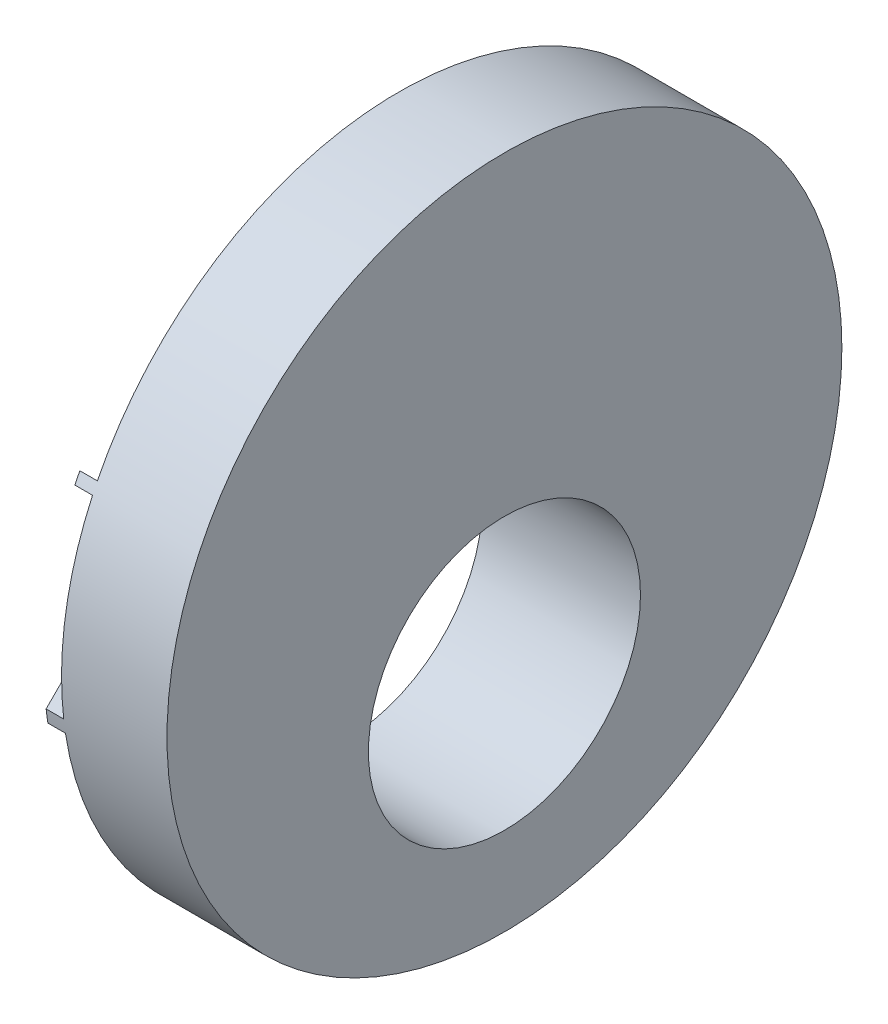
ISO-10303-21;
HEADER;
FILE_DESCRIPTION(('STEP AP214'),'2;1');
FILE_NAME('part.step','',(''),(''),'','','');
FILE_SCHEMA(('AUTOMOTIVE_DESIGN { 1 0 10303 214 1 1 1 1 }'));
ENDSEC;
DATA;
#1=APPLICATION_CONTEXT('core data for automotive mechanical design processes');
#2=APPLICATION_PROTOCOL_DEFINITION('international standard','automotive_design',2000,#1);
#3=PRODUCT_CONTEXT('',#1,'mechanical');
#4=PRODUCT('Part','Part','',(#3));
#5=PRODUCT_RELATED_PRODUCT_CATEGORY('part','',(#4));
#6=PRODUCT_DEFINITION_FORMATION('','',#4);
#7=PRODUCT_DEFINITION_CONTEXT('part definition',#1,'design');
#8=PRODUCT_DEFINITION('design','',#6,#7);
#9=PRODUCT_DEFINITION_SHAPE('','',#8);
#10=(LENGTH_UNIT() NAMED_UNIT(*) SI_UNIT(.MILLI.,.METRE.));
#11=(NAMED_UNIT(*) PLANE_ANGLE_UNIT() SI_UNIT($,.RADIAN.));
#12=(NAMED_UNIT(*) SI_UNIT($,.STERADIAN.) SOLID_ANGLE_UNIT());
#13=UNCERTAINTY_MEASURE_WITH_UNIT(LENGTH_MEASURE(1.E-05),#10,'distance_accuracy_value','');
#14=(GEOMETRIC_REPRESENTATION_CONTEXT(3) GLOBAL_UNCERTAINTY_ASSIGNED_CONTEXT((#13)) GLOBAL_UNIT_ASSIGNED_CONTEXT((#10,
#11,#12)) REPRESENTATION_CONTEXT('',''));
#15=CARTESIAN_POINT('',(0.,0.,0.));
#16=DIRECTION('',(0.,0.,1.));
#17=DIRECTION('',(1.,0.,0.));
#18=AXIS2_PLACEMENT_3D('',#15,#16,#17);
#19=CARTESIAN_POINT('',(-7.5,0.,0.));
#20=DIRECTION('',(1.,0.,0.));
#21=DIRECTION('',(0.,0.,-1.));
#22=AXIS2_PLACEMENT_3D('',#19,#20,#21);
#23=PLANE('',#22);
#24=DIRECTION('',(0.,-0.707106781186547,-0.707106781186548));
#25=VECTOR('',#24,1.);
#26=CARTESIAN_POINT('',(-7.5,20.0772731857966,-20.0772731857966));
#27=LINE('',#26,#25);
#28=CARTESIAN_POINT('',(-7.5,3.21520654337298,-36.9393398282202));
#29=VERTEX_POINT('',#28);
#30=CARTESIAN_POINT('',(-7.5,-0.343943144876353,-40.4984895164695));
#31=VERTEX_POINT('',#30);
#32=EDGE_CURVE('E338',#29,#31,#27,.T.);
#33=ORIENTED_EDGE('',*,*,#32,.T.);
#34=CARTESIAN_POINT('',(-7.5,0.,0.));
#35=DIRECTION('',(-1.,0.,0.));
#36=DIRECTION('',(0.,0.,1.));
#37=AXIS2_PLACEMENT_3D('',#34,#35,#36);
#38=CIRCLE('',#37,40.49995);
#39=CARTESIAN_POINT('',(-7.5,-36.5562476229281,-17.4323466502265));
#40=VERTEX_POINT('',#39);
#41=EDGE_CURVE('E656',#31,#40,#38,.T.);
#42=ORIENTED_EDGE('',*,*,#41,.T.);
#43=CARTESIAN_POINT('',(-7.5,-16.134793456627,0.));
#44=DIRECTION('',(1.,0.,0.));
#45=DIRECTION('',(0.,0.,-1.));
#46=AXIS2_PLACEMENT_3D('',#43,#44,#45);
#47=CIRCLE('',#46,26.85);
#48=CARTESIAN_POINT('',(-7.5,3.21520654337299,-18.6145104689863));
#49=VERTEX_POINT('',#48);
#50=EDGE_CURVE('E545',#49,#40,#47,.F.);
#51=ORIENTED_EDGE('',*,*,#50,.F.);
#52=DIRECTION('',(0.,0.,1.));
#53=VECTOR('',#52,1.);
#54=CARTESIAN_POINT('',(-7.5,3.21520654337299,0.));
#55=LINE('',#54,#53);
#56=EDGE_CURVE('E413',#29,#49,#55,.T.);
#57=ORIENTED_EDGE('',*,*,#56,.F.);
#58=EDGE_LOOP('',(#33,#42,#51,#57));
#59=FACE_BOUND('',#58,.T.);
#60=ADVANCED_FACE('F41',(#59),#23,.F.);
#61=CARTESIAN_POINT('',(-7.5,-36.5562476229281,17.4323466502265));
#62=VERTEX_POINT('',#61);
#63=CARTESIAN_POINT('',(-7.5,3.21520654337299,18.6145104689863));
#64=VERTEX_POINT('',#63);
#65=EDGE_CURVE('E550',#62,#64,#47,.F.);
#66=ORIENTED_EDGE('',*,*,#65,.F.);
#67=CARTESIAN_POINT('',(-7.5,-0.343943144876385,40.4984895164695));
#68=VERTEX_POINT('',#67);
#69=EDGE_CURVE('E571',#62,#68,#38,.T.);
#70=ORIENTED_EDGE('',*,*,#69,.T.);
#71=DIRECTION('',(0.,-0.707106781186552,0.707106781186543));
#72=VECTOR('',#71,1.);
#73=CARTESIAN_POINT('',(-7.5,20.0772731857966,20.0772731857968));
#74=LINE('',#73,#72);
#75=CARTESIAN_POINT('',(-7.5,3.21520654337299,36.9393398282202));
#76=VERTEX_POINT('',#75);
#77=EDGE_CURVE('E417',#76,#68,#74,.T.);
#78=ORIENTED_EDGE('',*,*,#77,.F.);
#79=EDGE_CURVE('E418',#64,#76,#55,.T.);
#80=ORIENTED_EDGE('',*,*,#79,.F.);
#81=EDGE_LOOP('',(#66,#70,#78,#80));
#82=FACE_BOUND('',#81,.T.);
#83=ADVANCED_FACE('F645',(#82),#23,.F.);
#84=DIRECTION('',(0.,-1.,0.));
#85=VECTOR('',#84,1.);
#86=CARTESIAN_POINT('',(-7.5,0.,-38.));
#87=LINE('',#86,#85);
#88=CARTESIAN_POINT('',(-7.5,14.0087811747668,-38.));
#89=VERTEX_POINT('',#88);
#90=CARTESIAN_POINT('',(-7.5,4.27586671515281,-38.));
#91=VERTEX_POINT('',#90);
#92=EDGE_CURVE('E441',#89,#91,#87,.T.);
#93=ORIENTED_EDGE('',*,*,#92,.F.);
#94=CARTESIAN_POINT('',(-7.5,1.8166821462312,-40.4591845689216));
#95=VERTEX_POINT('',#94);
#96=EDGE_CURVE('E663',#89,#95,#38,.T.);
#97=ORIENTED_EDGE('',*,*,#96,.T.);
#98=DIRECTION('',(0.,-0.707106781186546,-0.707106781186549));
#99=VECTOR('',#98,1.);
#100=CARTESIAN_POINT('',(-7.5,21.1379333575764,-21.1379333575764));
#101=LINE('',#100,#99);
#102=EDGE_CURVE('E344',#91,#95,#101,.T.);
#103=ORIENTED_EDGE('',*,*,#102,.F.);
#104=EDGE_LOOP('',(#93,#97,#103));
#105=FACE_BOUND('',#104,.T.);
#106=ADVANCED_FACE('F637',(#105),#23,.F.);
#107=DIRECTION('',(0.,-0.707106781186552,0.707106781186543));
#108=VECTOR('',#107,1.);
#109=CARTESIAN_POINT('',(-7.5,21.1379333575764,21.1379333575766));
#110=LINE('',#109,#108);
#111=CARTESIAN_POINT('',(-7.5,4.27586671515281,38.));
#112=VERTEX_POINT('',#111);
#113=CARTESIAN_POINT('',(-7.5,1.81668214623118,40.4591845689216));
#114=VERTEX_POINT('',#113);
#115=EDGE_CURVE('E422',#112,#114,#110,.T.);
#116=ORIENTED_EDGE('',*,*,#115,.T.);
#117=CARTESIAN_POINT('',(-7.5,14.0087811747668,38.));
#118=VERTEX_POINT('',#117);
#119=EDGE_CURVE('E269',#114,#118,#38,.T.);
#120=ORIENTED_EDGE('',*,*,#119,.T.);
#121=DIRECTION('',(0.,1.,0.));
#122=VECTOR('',#121,1.);
#123=CARTESIAN_POINT('',(-7.5,0.,38.));
#124=LINE('',#123,#122);
#125=EDGE_CURVE('E425',#112,#118,#124,.T.);
#126=ORIENTED_EDGE('',*,*,#125,.F.);
#127=EDGE_LOOP('',(#116,#120,#126));
#128=FACE_BOUND('',#127,.T.);
#129=ADVANCED_FACE('F634',(#128),#23,.F.);
#130=DIRECTION('',(0.,0.70710678118655,0.707106781186545));
#131=VECTOR('',#130,1.);
#132=CARTESIAN_POINT('',(-7.5,-10.6870666424237,10.6870666424237));
#133=LINE('',#132,#131);
#134=CARTESIAN_POINT('',(-7.5,15.565206543373,36.9393398282202));
#135=VERTEX_POINT('',#134);
#136=CARTESIAN_POINT('',(-7.5,15.8818923432357,37.2560256280829));
#137=VERTEX_POINT('',#136);
#138=EDGE_CURVE('E429',#135,#137,#133,.T.);
#139=ORIENTED_EDGE('',*,*,#138,.T.);
#140=CARTESIAN_POINT('',(-7.5,15.8818923432357,-37.2560256280829));
#141=VERTEX_POINT('',#140);
#142=EDGE_CURVE('E569',#137,#141,#38,.T.);
#143=ORIENTED_EDGE('',*,*,#142,.T.);
#144=DIRECTION('',(0.,0.707106781186552,-0.707106781186543));
#145=VECTOR('',#144,1.);
#146=CARTESIAN_POINT('',(-7.5,-10.6870666424237,-10.6870666424238));
#147=LINE('',#146,#145);
#148=CARTESIAN_POINT('',(-7.5,15.565206543373,-36.9393398282202));
#149=VERTEX_POINT('',#148);
#150=EDGE_CURVE('E437',#149,#141,#147,.T.);
#151=ORIENTED_EDGE('',*,*,#150,.F.);
#152=DIRECTION('',(0.,0.,-1.));
#153=VECTOR('',#152,1.);
#154=CARTESIAN_POINT('',(-7.5,15.565206543373,0.));
#155=LINE('',#154,#153);
#156=EDGE_CURVE('E433',#135,#149,#155,.T.);
#157=ORIENTED_EDGE('',*,*,#156,.F.);
#158=EDGE_LOOP('',(#139,#143,#151,#157));
#159=FACE_BOUND('',#158,.T.);
#160=ADVANCED_FACE('F636',(#159),#23,.F.);
#161=CARTESIAN_POINT('',(-17.5,3.21520654337299,0.));
#162=DIRECTION('',(0.,1.,0.));
#163=DIRECTION('',(0.,0.,1.));
#164=AXIS2_PLACEMENT_3D('',#161,#162,#163);
#165=PLANE('',#164);
#166=DIRECTION('',(1.,0.,0.));
#167=VECTOR('',#166,1.);
#168=CARTESIAN_POINT('',(-22.5,3.21520654337299,18.6145104689863));
#169=LINE('',#168,#167);
#170=CARTESIAN_POINT('',(-17.5,3.21520654337299,18.6145104689863));
#171=VERTEX_POINT('',#170);
#172=EDGE_CURVE('E329',#64,#171,#169,.F.);
#173=ORIENTED_EDGE('',*,*,#172,.F.);
#174=ORIENTED_EDGE('',*,*,#79,.T.);
#175=DIRECTION('',(1.,0.,0.));
#176=VECTOR('',#175,1.);
#177=CARTESIAN_POINT('',(-17.5,3.21520654337299,36.9393398282202));
#178=LINE('',#177,#176);
#179=CARTESIAN_POINT('',(-17.5,3.21520654337299,36.9393398282202));
#180=VERTEX_POINT('',#179);
#181=EDGE_CURVE('E501',#180,#76,#178,.T.);
#182=ORIENTED_EDGE('',*,*,#181,.F.);
#183=DIRECTION('',(0.,0.,1.));
#184=VECTOR('',#183,1.);
#185=CARTESIAN_POINT('',(-17.5,3.21520654337299,0.));
#186=LINE('',#185,#184);
#187=EDGE_CURVE('E360',#171,#180,#186,.T.);
#188=ORIENTED_EDGE('',*,*,#187,.F.);
#189=EDGE_LOOP('',(#173,#174,#182,#188));
#190=FACE_BOUND('',#189,.T.);
#191=ADVANCED_FACE('F643',(#190),#165,.F.);
#192=DIRECTION('',(1.,0.,0.));
#193=VECTOR('',#192,1.);
#194=CARTESIAN_POINT('',(-22.5,3.21520654337299,-18.6145104689863));
#195=LINE('',#194,#193);
#196=CARTESIAN_POINT('',(-17.5,3.21520654337299,-18.6145104689863));
#197=VERTEX_POINT('',#196);
#198=EDGE_CURVE('E334',#197,#49,#195,.T.);
#199=ORIENTED_EDGE('',*,*,#198,.F.);
#200=CARTESIAN_POINT('',(-17.5,3.21520654337298,-36.9393398282202));
#201=VERTEX_POINT('',#200);
#202=EDGE_CURVE('E361',#201,#197,#186,.T.);
#203=ORIENTED_EDGE('',*,*,#202,.F.);
#204=DIRECTION('',(1.,0.,0.));
#205=VECTOR('',#204,1.);
#206=CARTESIAN_POINT('',(-17.5,3.21520654337298,-36.9393398282202));
#207=LINE('',#206,#205);
#208=EDGE_CURVE('E505',#201,#29,#207,.T.);
#209=ORIENTED_EDGE('',*,*,#208,.T.);
#210=ORIENTED_EDGE('',*,*,#56,.T.);
#211=EDGE_LOOP('',(#199,#203,#209,#210));
#212=FACE_BOUND('',#211,.T.);
#213=ADVANCED_FACE('F745',(#212),#165,.F.);
#214=CARTESIAN_POINT('',(-7.5,12.565206543373,35.));
#215=DIRECTION('',(0.,0.,1.));
#216=DIRECTION('',(1.,0.,0.));
#217=AXIS2_PLACEMENT_3D('',#214,#215,#216);
#218=PLANE('',#217);
#219=DIRECTION('',(0.,-1.,0.));
#220=VECTOR('',#219,1.);
#221=CARTESIAN_POINT('',(-5.,12.565206543373,35.));
#222=LINE('',#221,#220);
#223=CARTESIAN_POINT('',(-5.,12.565206543373,35.));
#224=VERTEX_POINT('',#223);
#225=CARTESIAN_POINT('',(-5.,6.21520654337299,35.));
#226=VERTEX_POINT('',#225);
#227=EDGE_CURVE('E512',#224,#226,#222,.T.);
#228=ORIENTED_EDGE('',*,*,#227,.T.);
#229=DIRECTION('',(1.,0.,0.));
#230=VECTOR('',#229,1.);
#231=CARTESIAN_POINT('',(-7.5,6.21520654337299,35.));
#232=LINE('',#231,#230);
#233=CARTESIAN_POINT('',(-17.5,6.21520654337299,35.));
#234=VERTEX_POINT('',#233);
#235=EDGE_CURVE('E522',#234,#226,#232,.T.);
#236=ORIENTED_EDGE('',*,*,#235,.F.);
#237=DIRECTION('',(0.,-1.,0.));
#238=VECTOR('',#237,1.);
#239=CARTESIAN_POINT('',(-17.5,0.,35.));
#240=LINE('',#239,#238);
#241=CARTESIAN_POINT('',(-17.5,12.565206543373,35.));
#242=VERTEX_POINT('',#241);
#243=EDGE_CURVE('E348',#242,#234,#240,.T.);
#244=ORIENTED_EDGE('',*,*,#243,.F.);
#245=DIRECTION('',(1.,0.,0.));
#246=VECTOR('',#245,1.);
#247=CARTESIAN_POINT('',(-7.5,12.565206543373,35.));
#248=LINE('',#247,#246);
#249=EDGE_CURVE('E523',#242,#224,#248,.T.);
#250=ORIENTED_EDGE('',*,*,#249,.T.);
#251=EDGE_LOOP('',(#228,#236,#244,#250));
#252=FACE_BOUND('',#251,.T.);
#253=ADVANCED_FACE('F756',(#252),#218,.F.);
#254=CARTESIAN_POINT('',(-7.5,12.565206543373,-35.));
#255=DIRECTION('',(0.,1.,0.));
#256=DIRECTION('',(0.,0.,1.));
#257=AXIS2_PLACEMENT_3D('',#254,#255,#256);
#258=PLANE('',#257);
#259=DIRECTION('',(0.,0.,1.));
#260=VECTOR('',#259,1.);
#261=CARTESIAN_POINT('',(-5.,12.565206543373,-35.));
#262=LINE('',#261,#260);
#263=CARTESIAN_POINT('',(-5.,12.565206543373,-35.));
#264=VERTEX_POINT('',#263);
#265=EDGE_CURVE('E509',#264,#224,#262,.T.);
#266=ORIENTED_EDGE('',*,*,#265,.T.);
#267=ORIENTED_EDGE('',*,*,#249,.F.);
#268=DIRECTION('',(0.,0.,1.));
#269=VECTOR('',#268,1.);
#270=CARTESIAN_POINT('',(-17.5,12.565206543373,0.));
#271=LINE('',#270,#269);
#272=CARTESIAN_POINT('',(-17.5,12.565206543373,-35.));
#273=VERTEX_POINT('',#272);
#274=EDGE_CURVE('E343',#273,#242,#271,.T.);
#275=ORIENTED_EDGE('',*,*,#274,.F.);
#276=DIRECTION('',(1.,0.,0.));
#277=VECTOR('',#276,1.);
#278=CARTESIAN_POINT('',(-7.5,12.565206543373,-35.));
#279=LINE('',#278,#277);
#280=EDGE_CURVE('E528',#273,#264,#279,.T.);
#281=ORIENTED_EDGE('',*,*,#280,.T.);
#282=EDGE_LOOP('',(#266,#267,#275,#281));
#283=FACE_BOUND('',#282,.T.);
#284=ADVANCED_FACE('F752',(#283),#258,.F.);
#285=CARTESIAN_POINT('',(-7.5,6.21520654337299,-35.));
#286=DIRECTION('',(0.,0.,-1.));
#287=DIRECTION('',(-1.,0.,0.));
#288=AXIS2_PLACEMENT_3D('',#285,#286,#287);
#289=PLANE('',#288);
#290=DIRECTION('',(0.,1.,0.));
#291=VECTOR('',#290,1.);
#292=CARTESIAN_POINT('',(-5.,6.21520654337299,-35.));
#293=LINE('',#292,#291);
#294=CARTESIAN_POINT('',(-5.,6.21520654337299,-35.));
#295=VERTEX_POINT('',#294);
#296=EDGE_CURVE('E519',#295,#264,#293,.T.);
#297=ORIENTED_EDGE('',*,*,#296,.T.);
#298=ORIENTED_EDGE('',*,*,#280,.F.);
#299=DIRECTION('',(0.,1.,0.));
#300=VECTOR('',#299,1.);
#301=CARTESIAN_POINT('',(-17.5,0.,-35.));
#302=LINE('',#301,#300);
#303=CARTESIAN_POINT('',(-17.5,6.21520654337299,-35.));
#304=VERTEX_POINT('',#303);
#305=EDGE_CURVE('E339',#304,#273,#302,.T.);
#306=ORIENTED_EDGE('',*,*,#305,.F.);
#307=DIRECTION('',(1.,0.,0.));
#308=VECTOR('',#307,1.);
#309=CARTESIAN_POINT('',(-7.5,6.21520654337299,-35.));
#310=LINE('',#309,#308);
#311=EDGE_CURVE('E532',#304,#295,#310,.T.);
#312=ORIENTED_EDGE('',*,*,#311,.T.);
#313=EDGE_LOOP('',(#297,#298,#306,#312));
#314=FACE_BOUND('',#313,.T.);
#315=ADVANCED_FACE('F755',(#314),#289,.F.);
#316=CARTESIAN_POINT('',(-7.5,6.21520654337299,35.));
#317=DIRECTION('',(0.,-1.,0.));
#318=DIRECTION('',(0.,0.,-1.));
#319=AXIS2_PLACEMENT_3D('',#316,#317,#318);
#320=PLANE('',#319);
#321=DIRECTION('',(0.,0.,-1.));
#322=VECTOR('',#321,1.);
#323=CARTESIAN_POINT('',(-17.5,6.21520654337299,0.));
#324=LINE('',#323,#322);
#325=CARTESIAN_POINT('',(-17.5,6.21520654337299,-14.8795161211647));
#326=VERTEX_POINT('',#325);
#327=EDGE_CURVE('E352',#326,#304,#324,.T.);
#328=ORIENTED_EDGE('',*,*,#327,.F.);
#329=DIRECTION('',(1.,0.,0.));
#330=VECTOR('',#329,1.);
#331=CARTESIAN_POINT('',(-22.5,6.21520654337298,-14.8795161211647));
#332=LINE('',#331,#330);
#333=CARTESIAN_POINT('',(-22.5,6.21520654337298,-14.8795161211647));
#334=VERTEX_POINT('',#333);
#335=EDGE_CURVE('E319',#334,#326,#332,.T.);
#336=ORIENTED_EDGE('',*,*,#335,.F.);
#337=DIRECTION('',(0.,0.,-1.));
#338=VECTOR('',#337,1.);
#339=CARTESIAN_POINT('',(-22.5,6.21520654337298,14.8795161211647));
#340=LINE('',#339,#338);
#341=CARTESIAN_POINT('',(-22.5,6.21520654337298,14.8795161211647));
#342=VERTEX_POINT('',#341);
#343=EDGE_CURVE('E316',#342,#334,#340,.T.);
#344=ORIENTED_EDGE('',*,*,#343,.F.);
#345=DIRECTION('',(1.,0.,0.));
#346=VECTOR('',#345,1.);
#347=CARTESIAN_POINT('',(-22.5,6.21520654337298,14.8795161211647));
#348=LINE('',#347,#346);
#349=CARTESIAN_POINT('',(-17.5,6.21520654337299,14.8795161211647));
#350=VERTEX_POINT('',#349);
#351=EDGE_CURVE('E323',#342,#350,#348,.T.);
#352=ORIENTED_EDGE('',*,*,#351,.T.);
#353=EDGE_CURVE('E353',#234,#350,#324,.T.);
#354=ORIENTED_EDGE('',*,*,#353,.F.);
#355=ORIENTED_EDGE('',*,*,#235,.T.);
#356=DIRECTION('',(0.,0.,-1.));
#357=VECTOR('',#356,1.);
#358=CARTESIAN_POINT('',(-5.,6.21520654337299,35.));
#359=LINE('',#358,#357);
#360=EDGE_CURVE('E516',#226,#295,#359,.T.);
#361=ORIENTED_EDGE('',*,*,#360,.T.);
#362=ORIENTED_EDGE('',*,*,#311,.F.);
#363=EDGE_LOOP('',(#328,#336,#344,#352,#354,#355,#361,#362));
#364=FACE_BOUND('',#363,.T.);
#365=ADVANCED_FACE('F684',(#364),#320,.F.);
#366=CARTESIAN_POINT('',(-5.,0.,0.));
#367=DIRECTION('',(1.,0.,0.));
#368=DIRECTION('',(0.,0.,-1.));
#369=AXIS2_PLACEMENT_3D('',#366,#367,#368);
#370=PLANE('',#369);
#371=ORIENTED_EDGE('',*,*,#265,.F.);
#372=ORIENTED_EDGE('',*,*,#296,.F.);
#373=ORIENTED_EDGE('',*,*,#360,.F.);
#374=ORIENTED_EDGE('',*,*,#227,.F.);
#375=EDGE_LOOP('',(#371,#372,#373,#374));
#376=FACE_BOUND('',#375,.T.);
#377=ADVANCED_FACE('F748',(#376),#370,.F.);
#378=CARTESIAN_POINT('',(-17.5,20.0772731857966,-20.0772731857966));
#379=DIRECTION('',(0.,-0.707106781186548,0.707106781186547));
#380=DIRECTION('',(0.,-0.707106781186547,-0.707106781186548));
#381=AXIS2_PLACEMENT_3D('',#378,#379,#380);
#382=PLANE('',#381);
#383=DIRECTION('',(0.,-0.707106781186547,-0.707106781186548));
#384=VECTOR('',#383,1.);
#385=CARTESIAN_POINT('',(-15.,20.0772731857966,-20.0772731857966));
#386=LINE('',#385,#384);
#387=CARTESIAN_POINT('',(-15.,-0.343943144876353,-40.4984895164695));
#388=VERTEX_POINT('',#387);
#389=CARTESIAN_POINT('',(-15.,-7.288776975382,-47.4433233469752));
#390=VERTEX_POINT('',#389);
#391=EDGE_CURVE('E300',#388,#390,#386,.T.);
#392=ORIENTED_EDGE('',*,*,#391,.F.);
#393=DIRECTION('',(1.,0.,0.));
#394=VECTOR('',#393,1.);
#395=CARTESIAN_POINT('',(-15.,-0.343943144876353,-40.4984895164695));
#396=LINE('',#395,#394);
#397=EDGE_CURVE('E596',#31,#388,#396,.F.);
#398=ORIENTED_EDGE('',*,*,#397,.F.);
#399=ORIENTED_EDGE('',*,*,#32,.F.);
#400=ORIENTED_EDGE('',*,*,#208,.F.);
#401=DIRECTION('',(0.,-0.707106781186547,-0.707106781186548));
#402=VECTOR('',#401,1.);
#403=CARTESIAN_POINT('',(-17.5,20.0772731857966,-20.0772731857966));
#404=LINE('',#403,#402);
#405=CARTESIAN_POINT('',(-17.5,-7.288776975382,-47.4433233469752));
#406=VERTEX_POINT('',#405);
#407=EDGE_CURVE('E356',#201,#406,#404,.T.);
#408=ORIENTED_EDGE('',*,*,#407,.T.);
#409=DIRECTION('',(1.,0.,0.));
#410=VECTOR('',#409,1.);
#411=CARTESIAN_POINT('',(-17.5,-7.288776975382,-47.4433233469752));
#412=LINE('',#411,#410);
#413=EDGE_CURVE('E447',#406,#390,#412,.T.);
#414=ORIENTED_EDGE('',*,*,#413,.T.);
#415=EDGE_LOOP('',(#392,#398,#399,#400,#408,#414));
#416=FACE_BOUND('',#415,.T.);
#417=ADVANCED_FACE('F659',(#416),#382,.T.);
#418=CARTESIAN_POINT('',(-17.5,20.0772731857966,20.0772731857968));
#419=DIRECTION('',(0.,0.707106781186543,0.707106781186552));
#420=DIRECTION('',(0.,-0.707106781186552,0.707106781186543));
#421=AXIS2_PLACEMENT_3D('',#418,#419,#420);
#422=PLANE('',#421);
#423=DIRECTION('',(1.,0.,0.));
#424=VECTOR('',#423,1.);
#425=CARTESIAN_POINT('',(-15.,-0.343943144876385,40.4984895164695));
#426=LINE('',#425,#424);
#427=CARTESIAN_POINT('',(-15.,-0.343943144876385,40.4984895164695));
#428=VERTEX_POINT('',#427);
#429=EDGE_CURVE('E275',#68,#428,#426,.F.);
#430=ORIENTED_EDGE('',*,*,#429,.T.);
#431=DIRECTION('',(0.,-0.707106781186552,0.707106781186543));
#432=VECTOR('',#431,1.);
#433=CARTESIAN_POINT('',(-15.,20.0772731857966,20.0772731857968));
#434=LINE('',#433,#432);
#435=CARTESIAN_POINT('',(-15.,-7.28877697538212,47.4433233469752));
#436=VERTEX_POINT('',#435);
#437=EDGE_CURVE('E295',#428,#436,#434,.T.);
#438=ORIENTED_EDGE('',*,*,#437,.T.);
#439=DIRECTION('',(1.,0.,0.));
#440=VECTOR('',#439,1.);
#441=CARTESIAN_POINT('',(-17.5,-7.28877697538212,47.4433233469752));
#442=LINE('',#441,#440);
#443=CARTESIAN_POINT('',(-17.5,-7.28877697538212,47.4433233469752));
#444=VERTEX_POINT('',#443);
#445=EDGE_CURVE('E497',#444,#436,#442,.T.);
#446=ORIENTED_EDGE('',*,*,#445,.F.);
#447=DIRECTION('',(0.,-0.707106781186552,0.707106781186543));
#448=VECTOR('',#447,1.);
#449=CARTESIAN_POINT('',(-17.5,20.0772731857966,20.0772731857968));
#450=LINE('',#449,#448);
#451=EDGE_CURVE('E365',#180,#444,#450,.T.);
#452=ORIENTED_EDGE('',*,*,#451,.F.);
#453=ORIENTED_EDGE('',*,*,#181,.T.);
#454=ORIENTED_EDGE('',*,*,#77,.T.);
#455=EDGE_LOOP('',(#430,#438,#446,#452,#453,#454));
#456=FACE_BOUND('',#455,.T.);
#457=ADVANCED_FACE('F671',(#456),#422,.F.);
#458=CARTESIAN_POINT('',(-17.5,21.1379333575764,21.1379333575766));
#459=DIRECTION('',(0.,0.707106781186543,0.707106781186552));
#460=DIRECTION('',(0.,-0.707106781186552,0.707106781186543));
#461=AXIS2_PLACEMENT_3D('',#458,#459,#460);
#462=PLANE('',#461);
#463=DIRECTION('',(0.,-0.707106781186552,0.707106781186543));
#464=VECTOR('',#463,1.);
#465=CARTESIAN_POINT('',(-15.,21.1379333575764,21.1379333575766));
#466=LINE('',#465,#464);
#467=CARTESIAN_POINT('',(-15.,1.81668214623118,40.4591845689216));
#468=VERTEX_POINT('',#467);
#469=CARTESIAN_POINT('',(-15.,-5.41739329023408,47.6932600053868));
#470=VERTEX_POINT('',#469);
#471=EDGE_CURVE('E280',#468,#470,#466,.T.);
#472=ORIENTED_EDGE('',*,*,#471,.F.);
#473=DIRECTION('',(1.,0.,0.));
#474=VECTOR('',#473,1.);
#475=CARTESIAN_POINT('',(-15.,1.81668214623118,40.4591845689216));
#476=LINE('',#475,#474);
#477=EDGE_CURVE('E263',#114,#468,#476,.F.);
#478=ORIENTED_EDGE('',*,*,#477,.F.);
#479=ORIENTED_EDGE('',*,*,#115,.F.);
#480=DIRECTION('',(1.,0.,0.));
#481=VECTOR('',#480,1.);
#482=CARTESIAN_POINT('',(-17.5,4.27586671515281,38.));
#483=LINE('',#482,#481);
#484=CARTESIAN_POINT('',(-17.5,4.27586671515281,38.));
#485=VERTEX_POINT('',#484);
#486=EDGE_CURVE('E491',#485,#112,#483,.T.);
#487=ORIENTED_EDGE('',*,*,#486,.F.);
#488=DIRECTION('',(0.,-0.707106781186552,0.707106781186543));
#489=VECTOR('',#488,1.);
#490=CARTESIAN_POINT('',(-17.5,21.1379333575764,21.1379333575766));
#491=LINE('',#490,#489);
#492=CARTESIAN_POINT('',(-17.5,-5.41739329023409,47.6932600053868));
#493=VERTEX_POINT('',#492);
#494=EDGE_CURVE('E372',#485,#493,#491,.T.);
#495=ORIENTED_EDGE('',*,*,#494,.T.);
#496=DIRECTION('',(1.,0.,0.));
#497=VECTOR('',#496,1.);
#498=CARTESIAN_POINT('',(-17.5,-5.41739329023409,47.6932600053868));
#499=LINE('',#498,#497);
#500=EDGE_CURVE('E293',#493,#470,#499,.T.);
#501=ORIENTED_EDGE('',*,*,#500,.T.);
#502=EDGE_LOOP('',(#472,#478,#479,#487,#495,#501));
#503=FACE_BOUND('',#502,.T.);
#504=ADVANCED_FACE('F290',(#503),#462,.T.);
#505=CARTESIAN_POINT('',(-17.5,0.,38.));
#506=DIRECTION('',(0.,0.,-1.));
#507=DIRECTION('',(-1.,0.,0.));
#508=AXIS2_PLACEMENT_3D('',#505,#506,#507);
#509=PLANE('',#508);
#510=DIRECTION('',(1.,0.,0.));
#511=VECTOR('',#510,1.);
#512=CARTESIAN_POINT('',(-15.,14.0087811747668,38.));
#513=LINE('',#512,#511);
#514=CARTESIAN_POINT('',(-15.,14.0087811747668,38.));
#515=VERTEX_POINT('',#514);
#516=EDGE_CURVE('E276',#118,#515,#513,.F.);
#517=ORIENTED_EDGE('',*,*,#516,.T.);
#518=DIRECTION('',(0.,1.,0.));
#519=VECTOR('',#518,1.);
#520=CARTESIAN_POINT('',(-15.,0.,38.));
#521=LINE('',#520,#519);
#522=CARTESIAN_POINT('',(-15.,14.5045463715932,38.));
#523=VERTEX_POINT('',#522);
#524=EDGE_CURVE('E283',#515,#523,#521,.T.);
#525=ORIENTED_EDGE('',*,*,#524,.T.);
#526=DIRECTION('',(1.,0.,0.));
#527=VECTOR('',#526,1.);
#528=CARTESIAN_POINT('',(-17.5,14.5045463715932,38.));
#529=LINE('',#528,#527);
#530=CARTESIAN_POINT('',(-17.5,14.5045463715932,38.));
#531=VERTEX_POINT('',#530);
#532=EDGE_CURVE('E487',#531,#523,#529,.T.);
#533=ORIENTED_EDGE('',*,*,#532,.F.);
#534=DIRECTION('',(0.,1.,0.));
#535=VECTOR('',#534,1.);
#536=CARTESIAN_POINT('',(-17.5,0.,38.));
#537=LINE('',#536,#535);
#538=EDGE_CURVE('E377',#485,#531,#537,.T.);
#539=ORIENTED_EDGE('',*,*,#538,.F.);
#540=ORIENTED_EDGE('',*,*,#486,.T.);
#541=ORIENTED_EDGE('',*,*,#125,.T.);
#542=EDGE_LOOP('',(#517,#525,#533,#539,#540,#541));
#543=FACE_BOUND('',#542,.T.);
#544=ADVANCED_FACE('F632',(#543),#509,.F.);
#545=CARTESIAN_POINT('',(-17.5,-11.7477268142035,11.7477268142035));
#546=DIRECTION('',(0.,0.707106781186546,-0.707106781186549));
#547=DIRECTION('',(0.,0.707106781186549,0.707106781186546));
#548=AXIS2_PLACEMENT_3D('',#545,#546,#547);
#549=PLANE('',#548);
#550=ORIENTED_EDGE('',*,*,#532,.T.);
#551=DIRECTION('',(0.,0.707106781186549,0.707106781186546));
#552=VECTOR('',#551,1.);
#553=CARTESIAN_POINT('',(-15.,-11.7477268142035,11.7477268142035));
#554=LINE('',#553,#552);
#555=CARTESIAN_POINT('',(-15.,20.0954595009268,43.5909131293336));
#556=VERTEX_POINT('',#555);
#557=EDGE_CURVE('E302',#523,#556,#554,.T.);
#558=ORIENTED_EDGE('',*,*,#557,.T.);
#559=DIRECTION('',(1.,0.,0.));
#560=VECTOR('',#559,1.);
#561=CARTESIAN_POINT('',(-17.5,20.0954595009268,43.5909131293336));
#562=LINE('',#561,#560);
#563=CARTESIAN_POINT('',(-17.5,20.0954595009268,43.5909131293336));
#564=VERTEX_POINT('',#563);
#565=EDGE_CURVE('E483',#564,#556,#562,.T.);
#566=ORIENTED_EDGE('',*,*,#565,.F.);
#567=DIRECTION('',(0.,0.707106781186549,0.707106781186546));
#568=VECTOR('',#567,1.);
#569=CARTESIAN_POINT('',(-17.5,-11.7477268142035,11.7477268142035));
#570=LINE('',#569,#568);
#571=EDGE_CURVE('E381',#531,#564,#570,.T.);
#572=ORIENTED_EDGE('',*,*,#571,.F.);
#573=EDGE_LOOP('',(#550,#558,#566,#572));
#574=FACE_BOUND('',#573,.T.);
#575=ADVANCED_FACE('F620',(#574),#549,.F.);
#576=CARTESIAN_POINT('',(-17.5,-10.6870666424237,10.6870666424237));
#577=DIRECTION('',(0.,0.707106781186545,-0.70710678118655));
#578=DIRECTION('',(0.,0.70710678118655,0.707106781186545));
#579=AXIS2_PLACEMENT_3D('',#576,#577,#578);
#580=PLANE('',#579);
#581=DIRECTION('',(0.,0.70710678118655,0.707106781186545));
#582=VECTOR('',#581,1.);
#583=CARTESIAN_POINT('',(-15.,-10.6870666424237,10.6870666424237));
#584=LINE('',#583,#582);
#585=CARTESIAN_POINT('',(-15.,15.8818923432357,37.2560256280829));
#586=VERTEX_POINT('',#585);
#587=CARTESIAN_POINT('',(-15.,21.5275916140541,42.9017248989013));
#588=VERTEX_POINT('',#587);
#589=EDGE_CURVE('E614',#586,#588,#584,.T.);
#590=ORIENTED_EDGE('',*,*,#589,.F.);
#591=DIRECTION('',(1.,0.,0.));
#592=VECTOR('',#591,1.);
#593=CARTESIAN_POINT('',(-15.,15.8818923432357,37.2560256280829));
#594=LINE('',#593,#592);
#595=EDGE_CURVE('E589',#137,#586,#594,.F.);
#596=ORIENTED_EDGE('',*,*,#595,.F.);
#597=ORIENTED_EDGE('',*,*,#138,.F.);
#598=DIRECTION('',(1.,0.,0.));
#599=VECTOR('',#598,1.);
#600=CARTESIAN_POINT('',(-17.5,15.565206543373,36.9393398282202));
#601=LINE('',#600,#599);
#602=CARTESIAN_POINT('',(-17.5,15.565206543373,36.9393398282202));
#603=VERTEX_POINT('',#602);
#604=EDGE_CURVE('E475',#603,#135,#601,.T.);
#605=ORIENTED_EDGE('',*,*,#604,.F.);
#606=DIRECTION('',(0.,0.70710678118655,0.707106781186545));
#607=VECTOR('',#606,1.);
#608=CARTESIAN_POINT('',(-17.5,-10.6870666424237,10.6870666424237));
#609=LINE('',#608,#607);
#610=CARTESIAN_POINT('',(-17.5,21.5275916140541,42.9017248989013));
#611=VERTEX_POINT('',#610);
#612=EDGE_CURVE('E385',#603,#611,#609,.T.);
#613=ORIENTED_EDGE('',*,*,#612,.T.);
#614=DIRECTION('',(1.,0.,0.));
#615=VECTOR('',#614,1.);
#616=CARTESIAN_POINT('',(-17.5,21.5275916140541,42.9017248989013));
#617=LINE('',#616,#615);
#618=EDGE_CURVE('E479',#611,#588,#617,.T.);
#619=ORIENTED_EDGE('',*,*,#618,.T.);
#620=EDGE_LOOP('',(#590,#596,#597,#605,#613,#619));
#621=FACE_BOUND('',#620,.T.);
#622=ADVANCED_FACE('F726',(#621),#580,.T.);
#623=CARTESIAN_POINT('',(-17.5,15.565206543373,0.));
#624=DIRECTION('',(0.,-1.,0.));
#625=DIRECTION('',(0.,0.,-1.));
#626=AXIS2_PLACEMENT_3D('',#623,#624,#625);
#627=PLANE('',#626);
#628=ORIENTED_EDGE('',*,*,#156,.T.);
#629=DIRECTION('',(1.,0.,0.));
#630=VECTOR('',#629,1.);
#631=CARTESIAN_POINT('',(-17.5,15.565206543373,-36.9393398282202));
#632=LINE('',#631,#630);
#633=CARTESIAN_POINT('',(-17.5,15.565206543373,-36.9393398282202));
#634=VERTEX_POINT('',#633);
#635=EDGE_CURVE('E471',#634,#149,#632,.T.);
#636=ORIENTED_EDGE('',*,*,#635,.F.);
#637=DIRECTION('',(0.,0.,-1.));
#638=VECTOR('',#637,1.);
#639=CARTESIAN_POINT('',(-17.5,15.565206543373,0.));
#640=LINE('',#639,#638);
#641=EDGE_CURVE('E389',#603,#634,#640,.T.);
#642=ORIENTED_EDGE('',*,*,#641,.F.);
#643=ORIENTED_EDGE('',*,*,#604,.T.);
#644=EDGE_LOOP('',(#628,#636,#642,#643));
#645=FACE_BOUND('',#644,.T.);
#646=ADVANCED_FACE('F718',(#645),#627,.F.);
#647=CARTESIAN_POINT('',(-17.5,-10.6870666424237,-10.6870666424238));
#648=DIRECTION('',(0.,-0.707106781186543,-0.707106781186552));
#649=DIRECTION('',(0.,0.707106781186552,-0.707106781186543));
#650=AXIS2_PLACEMENT_3D('',#647,#648,#649);
#651=PLANE('',#650);
#652=DIRECTION('',(1.,0.,0.));
#653=VECTOR('',#652,1.);
#654=CARTESIAN_POINT('',(-15.,15.8818923432357,-37.2560256280829));
#655=LINE('',#654,#653);
#656=CARTESIAN_POINT('',(-15.,15.8818923432357,-37.2560256280829));
#657=VERTEX_POINT('',#656);
#658=EDGE_CURVE('E585',#141,#657,#655,.F.);
#659=ORIENTED_EDGE('',*,*,#658,.T.);
#660=DIRECTION('',(0.,0.707106781186552,-0.707106781186543));
#661=VECTOR('',#660,1.);
#662=CARTESIAN_POINT('',(-15.,-10.6870666424237,-10.6870666424238));
#663=LINE('',#662,#661);
#664=CARTESIAN_POINT('',(-15.,21.5275916140542,-42.9017248989013));
#665=VERTEX_POINT('',#664);
#666=EDGE_CURVE('E610',#657,#665,#663,.T.);
#667=ORIENTED_EDGE('',*,*,#666,.T.);
#668=DIRECTION('',(1.,0.,0.));
#669=VECTOR('',#668,1.);
#670=CARTESIAN_POINT('',(-17.5,21.5275916140542,-42.9017248989013));
#671=LINE('',#670,#669);
#672=CARTESIAN_POINT('',(-17.5,21.5275916140542,-42.9017248989013));
#673=VERTEX_POINT('',#672);
#674=EDGE_CURVE('E467',#673,#665,#671,.T.);
#675=ORIENTED_EDGE('',*,*,#674,.F.);
#676=DIRECTION('',(0.,0.707106781186552,-0.707106781186543));
#677=VECTOR('',#676,1.);
#678=CARTESIAN_POINT('',(-17.5,-10.6870666424237,-10.6870666424238));
#679=LINE('',#678,#677);
#680=EDGE_CURVE('E393',#634,#673,#679,.T.);
#681=ORIENTED_EDGE('',*,*,#680,.F.);
#682=ORIENTED_EDGE('',*,*,#635,.T.);
#683=ORIENTED_EDGE('',*,*,#150,.T.);
#684=EDGE_LOOP('',(#659,#667,#675,#681,#682,#683));
#685=FACE_BOUND('',#684,.T.);
#686=ADVANCED_FACE('F712',(#685),#651,.F.);
#687=CARTESIAN_POINT('',(-17.5,-11.7477268142035,-11.7477268142037));
#688=DIRECTION('',(0.,-0.707106781186543,-0.707106781186552));
#689=DIRECTION('',(0.,0.707106781186552,-0.707106781186543));
#690=AXIS2_PLACEMENT_3D('',#687,#688,#689);
#691=PLANE('',#690);
#692=DIRECTION('',(0.,0.707106781186552,-0.707106781186543));
#693=VECTOR('',#692,1.);
#694=CARTESIAN_POINT('',(-15.,-11.7477268142035,-11.7477268142037));
#695=LINE('',#694,#693);
#696=CARTESIAN_POINT('',(-15.,14.5045463715932,-38.));
#697=VERTEX_POINT('',#696);
#698=CARTESIAN_POINT('',(-15.,20.0954595009268,-43.5909131293336));
#699=VERTEX_POINT('',#698);
#700=EDGE_CURVE('E607',#697,#699,#695,.T.);
#701=ORIENTED_EDGE('',*,*,#700,.F.);
#702=DIRECTION('',(1.,0.,0.));
#703=VECTOR('',#702,1.);
#704=CARTESIAN_POINT('',(-17.5,14.5045463715932,-38.));
#705=LINE('',#704,#703);
#706=CARTESIAN_POINT('',(-17.5,14.5045463715932,-38.));
#707=VERTEX_POINT('',#706);
#708=EDGE_CURVE('E459',#707,#697,#705,.T.);
#709=ORIENTED_EDGE('',*,*,#708,.F.);
#710=DIRECTION('',(0.,0.707106781186552,-0.707106781186543));
#711=VECTOR('',#710,1.);
#712=CARTESIAN_POINT('',(-17.5,-11.7477268142035,-11.7477268142037));
#713=LINE('',#712,#711);
#714=CARTESIAN_POINT('',(-17.5,20.0954595009268,-43.5909131293336));
#715=VERTEX_POINT('',#714);
#716=EDGE_CURVE('E398',#707,#715,#713,.T.);
#717=ORIENTED_EDGE('',*,*,#716,.T.);
#718=DIRECTION('',(1.,0.,0.));
#719=VECTOR('',#718,1.);
#720=CARTESIAN_POINT('',(-17.5,20.0954595009268,-43.5909131293336));
#721=LINE('',#720,#719);
#722=EDGE_CURVE('E463',#715,#699,#721,.T.);
#723=ORIENTED_EDGE('',*,*,#722,.T.);
#724=EDGE_LOOP('',(#701,#709,#717,#723));
#725=FACE_BOUND('',#724,.T.);
#726=ADVANCED_FACE('F797',(#725),#691,.T.);
#727=CARTESIAN_POINT('',(-17.5,0.,-38.));
#728=DIRECTION('',(0.,0.,1.));
#729=DIRECTION('',(1.,0.,0.));
#730=AXIS2_PLACEMENT_3D('',#727,#728,#729);
#731=PLANE('',#730);
#732=ORIENTED_EDGE('',*,*,#708,.T.);
#733=DIRECTION('',(0.,-1.,0.));
#734=VECTOR('',#733,1.);
#735=CARTESIAN_POINT('',(-15.,0.,-38.));
#736=LINE('',#735,#734);
#737=CARTESIAN_POINT('',(-15.,14.0087811747668,-38.));
#738=VERTEX_POINT('',#737);
#739=EDGE_CURVE('E603',#697,#738,#736,.T.);
#740=ORIENTED_EDGE('',*,*,#739,.T.);
#741=DIRECTION('',(1.,0.,0.));
#742=VECTOR('',#741,1.);
#743=CARTESIAN_POINT('',(-15.,14.0087811747668,-38.));
#744=LINE('',#743,#742);
#745=EDGE_CURVE('E581',#738,#89,#744,.T.);
#746=ORIENTED_EDGE('',*,*,#745,.T.);
#747=ORIENTED_EDGE('',*,*,#92,.T.);
#748=DIRECTION('',(1.,0.,0.));
#749=VECTOR('',#748,1.);
#750=CARTESIAN_POINT('',(-17.5,4.27586671515281,-38.));
#751=LINE('',#750,#749);
#752=CARTESIAN_POINT('',(-17.5,4.27586671515281,-38.));
#753=VERTEX_POINT('',#752);
#754=EDGE_CURVE('E455',#753,#91,#751,.T.);
#755=ORIENTED_EDGE('',*,*,#754,.F.);
#756=DIRECTION('',(0.,-1.,0.));
#757=VECTOR('',#756,1.);
#758=CARTESIAN_POINT('',(-17.5,0.,-38.));
#759=LINE('',#758,#757);
#760=EDGE_CURVE('E402',#707,#753,#759,.T.);
#761=ORIENTED_EDGE('',*,*,#760,.F.);
#762=EDGE_LOOP('',(#732,#740,#746,#747,#755,#761));
#763=FACE_BOUND('',#762,.T.);
#764=ADVANCED_FACE('F793',(#763),#731,.F.);
#765=CARTESIAN_POINT('',(-17.5,21.1379333575764,-21.1379333575764));
#766=DIRECTION('',(0.,-0.707106781186549,0.707106781186546));
#767=DIRECTION('',(0.,-0.707106781186546,-0.707106781186549));
#768=AXIS2_PLACEMENT_3D('',#765,#766,#767);
#769=PLANE('',#768);
#770=DIRECTION('',(1.,0.,0.));
#771=VECTOR('',#770,1.);
#772=CARTESIAN_POINT('',(-15.,1.8166821462312,-40.4591845689216));
#773=LINE('',#772,#771);
#774=CARTESIAN_POINT('',(-15.,1.8166821462312,-40.4591845689216));
#775=VERTEX_POINT('',#774);
#776=EDGE_CURVE('E577',#95,#775,#773,.F.);
#777=ORIENTED_EDGE('',*,*,#776,.T.);
#778=DIRECTION('',(0.,-0.707106781186546,-0.707106781186549));
#779=VECTOR('',#778,1.);
#780=CARTESIAN_POINT('',(-15.,21.1379333575764,-21.1379333575764));
#781=LINE('',#780,#779);
#782=CARTESIAN_POINT('',(-15.,-5.41739329023396,-47.6932600053868));
#783=VERTEX_POINT('',#782);
#784=EDGE_CURVE('E599',#775,#783,#781,.T.);
#785=ORIENTED_EDGE('',*,*,#784,.T.);
#786=DIRECTION('',(1.,0.,0.));
#787=VECTOR('',#786,1.);
#788=CARTESIAN_POINT('',(-17.5,-5.41739329023396,-47.6932600053868));
#789=LINE('',#788,#787);
#790=CARTESIAN_POINT('',(-17.5,-5.41739329023396,-47.6932600053868));
#791=VERTEX_POINT('',#790);
#792=EDGE_CURVE('E451',#791,#783,#789,.T.);
#793=ORIENTED_EDGE('',*,*,#792,.F.);
#794=DIRECTION('',(0.,-0.707106781186546,-0.707106781186549));
#795=VECTOR('',#794,1.);
#796=CARTESIAN_POINT('',(-17.5,21.1379333575764,-21.1379333575764));
#797=LINE('',#796,#795);
#798=EDGE_CURVE('E406',#753,#791,#797,.T.);
#799=ORIENTED_EDGE('',*,*,#798,.F.);
#800=ORIENTED_EDGE('',*,*,#754,.T.);
#801=ORIENTED_EDGE('',*,*,#102,.T.);
#802=EDGE_LOOP('',(#777,#785,#793,#799,#800,#801));
#803=FACE_BOUND('',#802,.T.);
#804=ADVANCED_FACE('F790',(#803),#769,.F.);
#805=CARTESIAN_POINT('',(-17.5,0.,0.));
#806=DIRECTION('',(-1.,0.,0.));
#807=DIRECTION('',(0.,0.,1.));
#808=AXIS2_PLACEMENT_3D('',#805,#806,#807);
#809=PLANE('',#808);
#810=ORIENTED_EDGE('',*,*,#202,.T.);
#811=CARTESIAN_POINT('',(-17.5,-16.134793456627,0.));
#812=DIRECTION('',(-1.,0.,0.));
#813=DIRECTION('',(0.,0.,1.));
#814=AXIS2_PLACEMENT_3D('',#811,#812,#813);
#815=CIRCLE('',#814,26.85);
#816=EDGE_CURVE('E330',#197,#326,#815,.F.);
#817=ORIENTED_EDGE('',*,*,#816,.T.);
#818=ORIENTED_EDGE('',*,*,#327,.T.);
#819=ORIENTED_EDGE('',*,*,#305,.T.);
#820=ORIENTED_EDGE('',*,*,#274,.T.);
#821=ORIENTED_EDGE('',*,*,#243,.T.);
#822=ORIENTED_EDGE('',*,*,#353,.T.);
#823=EDGE_CURVE('E65',#350,#171,#815,.F.);
#824=ORIENTED_EDGE('',*,*,#823,.T.);
#825=ORIENTED_EDGE('',*,*,#187,.T.);
#826=ORIENTED_EDGE('',*,*,#451,.T.);
#827=CARTESIAN_POINT('',(-17.5,0.,0.));
#828=DIRECTION('',(-1.,0.,0.));
#829=DIRECTION('',(0.,0.,1.));
#830=AXIS2_PLACEMENT_3D('',#827,#828,#829);
#831=CIRCLE('',#830,47.99995);
#832=EDGE_CURVE('E369',#444,#493,#831,.T.);
#833=ORIENTED_EDGE('',*,*,#832,.T.);
#834=ORIENTED_EDGE('',*,*,#494,.F.);
#835=ORIENTED_EDGE('',*,*,#538,.T.);
#836=ORIENTED_EDGE('',*,*,#571,.T.);
#837=EDGE_CURVE('E374',#564,#611,#831,.T.);
#838=ORIENTED_EDGE('',*,*,#837,.T.);
#839=ORIENTED_EDGE('',*,*,#612,.F.);
#840=ORIENTED_EDGE('',*,*,#641,.T.);
#841=ORIENTED_EDGE('',*,*,#680,.T.);
#842=EDGE_CURVE('E397',#673,#715,#831,.T.);
#843=ORIENTED_EDGE('',*,*,#842,.T.);
#844=ORIENTED_EDGE('',*,*,#716,.F.);
#845=ORIENTED_EDGE('',*,*,#760,.T.);
#846=ORIENTED_EDGE('',*,*,#798,.T.);
#847=EDGE_CURVE('E373',#791,#406,#831,.T.);
#848=ORIENTED_EDGE('',*,*,#847,.T.);
#849=ORIENTED_EDGE('',*,*,#407,.F.);
#850=EDGE_LOOP('',(#810,#817,#818,#819,#820,#821,#822,#824,#825,#826,#833,#834,#835,#836,#838,
#839,#840,#841,#843,#844,#845,#846,#848,#849));
#851=FACE_BOUND('',#850,.T.);
#852=ADVANCED_FACE('F628',(#851),#809,.T.);
#853=CARTESIAN_POINT('',(0.,0.,0.));
#854=DIRECTION('',(1.,0.,0.));
#855=DIRECTION('',(0.,0.,-1.));
#856=AXIS2_PLACEMENT_3D('',#853,#854,#855);
#857=PLANE('',#856);
#858=CARTESIAN_POINT('',(0.,-16.134793456627,0.));
#859=DIRECTION('',(1.,0.,0.));
#860=DIRECTION('',(0.,0.,-1.));
#861=AXIS2_PLACEMENT_3D('',#858,#859,#860);
#862=CIRCLE('',#861,19.35);
#863=CARTESIAN_POINT('',(0.,-16.134793456627,-19.35));
#864=VERTEX_POINT('',#863);
#865=EDGE_CURVE('E527',#864,#864,#862,.T.);
#866=ORIENTED_EDGE('',*,*,#865,.F.);
#867=EDGE_LOOP('',(#866));
#868=FACE_BOUND('',#867,.T.);
#869=CARTESIAN_POINT('',(0.,0.,0.));
#870=DIRECTION('',(1.,0.,0.));
#871=DIRECTION('',(0.,0.,-1.));
#872=AXIS2_PLACEMENT_3D('',#869,#870,#871);
#873=CIRCLE('',#872,47.99995);
#874=CARTESIAN_POINT('',(0.,0.,-47.99995));
#875=VERTEX_POINT('',#874);
#876=EDGE_CURVE('E541',#875,#875,#873,.T.);
#877=ORIENTED_EDGE('',*,*,#876,.T.);
#878=EDGE_LOOP('',(#877));
#879=FACE_BOUND('',#878,.T.);
#880=ADVANCED_FACE('F767',(#868,#879),#857,.T.);
#881=CARTESIAN_POINT('',(-7.5,-16.134793456627,0.));
#882=DIRECTION('',(1.,0.,0.));
#883=DIRECTION('',(0.,0.,-1.));
#884=AXIS2_PLACEMENT_3D('',#881,#882,#883);
#885=CYLINDRICAL_SURFACE('',#884,19.35);
#886=ORIENTED_EDGE('',*,*,#865,.T.);
#887=EDGE_LOOP('',(#886));
#888=FACE_BOUND('',#887,.T.);
#889=CARTESIAN_POINT('',(-22.5,-16.134793456627,0.));
#890=DIRECTION('',(-1.,0.,0.));
#891=DIRECTION('',(0.,0.,1.));
#892=AXIS2_PLACEMENT_3D('',#889,#890,#891);
#893=CIRCLE('',#892,19.35);
#894=CARTESIAN_POINT('',(-22.5,-16.134793456627,19.35));
#895=VERTEX_POINT('',#894);
#896=EDGE_CURVE('E308',#895,#895,#893,.T.);
#897=ORIENTED_EDGE('',*,*,#896,.T.);
#898=EDGE_LOOP('',(#897));
#899=FACE_BOUND('',#898,.T.);
#900=ADVANCED_FACE('F765',(#888,#899),#885,.F.);
#901=CARTESIAN_POINT('',(-7.5,0.,0.));
#902=DIRECTION('',(1.,0.,0.));
#903=DIRECTION('',(0.,0.,-1.));
#904=AXIS2_PLACEMENT_3D('',#901,#902,#903);
#905=CYLINDRICAL_SURFACE('',#904,47.99995);
#906=ORIENTED_EDGE('',*,*,#565,.T.);
#907=CARTESIAN_POINT('',(-15.,0.,0.));
#908=DIRECTION('',(-1.,0.,0.));
#909=DIRECTION('',(0.,0.,1.));
#910=AXIS2_PLACEMENT_3D('',#907,#908,#909);
#911=CIRCLE('',#910,47.99995);
#912=EDGE_CURVE('E285',#470,#556,#911,.T.);
#913=ORIENTED_EDGE('',*,*,#912,.F.);
#914=ORIENTED_EDGE('',*,*,#500,.F.);
#915=ORIENTED_EDGE('',*,*,#832,.F.);
#916=ORIENTED_EDGE('',*,*,#445,.T.);
#917=EDGE_CURVE('E575',#390,#436,#911,.T.);
#918=ORIENTED_EDGE('',*,*,#917,.F.);
#919=ORIENTED_EDGE('',*,*,#413,.F.);
#920=ORIENTED_EDGE('',*,*,#847,.F.);
#921=ORIENTED_EDGE('',*,*,#792,.T.);
#922=EDGE_CURVE('E700',#699,#783,#911,.T.);
#923=ORIENTED_EDGE('',*,*,#922,.F.);
#924=ORIENTED_EDGE('',*,*,#722,.F.);
#925=ORIENTED_EDGE('',*,*,#842,.F.);
#926=ORIENTED_EDGE('',*,*,#674,.T.);
#927=EDGE_CURVE('E576',#588,#665,#911,.T.);
#928=ORIENTED_EDGE('',*,*,#927,.F.);
#929=ORIENTED_EDGE('',*,*,#618,.F.);
#930=ORIENTED_EDGE('',*,*,#837,.F.);
#931=EDGE_LOOP('',(#906,#913,#914,#915,#916,#918,#919,#920,#921,#923,#924,#925,#926,#928,#929,#930));
#932=FACE_BOUND('',#931,.T.);
#933=ORIENTED_EDGE('',*,*,#876,.F.);
#934=EDGE_LOOP('',(#933));
#935=FACE_BOUND('',#934,.T.);
#936=ADVANCED_FACE('F43',(#932,#935),#905,.T.);
#937=CARTESIAN_POINT('',(-22.5,-16.134793456627,0.));
#938=DIRECTION('',(1.,0.,0.));
#939=DIRECTION('',(0.,0.,-1.));
#940=AXIS2_PLACEMENT_3D('',#937,#938,#939);
#941=CYLINDRICAL_SURFACE('',#940,26.85);
#942=CARTESIAN_POINT('',(-15.,-16.134793456627,0.));
#943=DIRECTION('',(-1.,0.,0.));
#944=DIRECTION('',(0.,0.,1.));
#945=AXIS2_PLACEMENT_3D('',#942,#943,#944);
#946=CIRCLE('',#945,26.85);
#947=CARTESIAN_POINT('',(-15.,-36.5562476229281,-17.4323466502265));
#948=VERTEX_POINT('',#947);
#949=CARTESIAN_POINT('',(-15.,-36.5562476229281,17.4323466502265));
#950=VERTEX_POINT('',#949);
#951=EDGE_CURVE('E50',#948,#950,#946,.T.);
#952=ORIENTED_EDGE('',*,*,#951,.T.);
#953=DIRECTION('',(1.,0.,0.));
#954=VECTOR('',#953,1.);
#955=CARTESIAN_POINT('',(-11.25,-36.5562476229281,17.4323466502265));
#956=LINE('',#955,#954);
#957=EDGE_CURVE('E11',#950,#62,#956,.T.);
#958=ORIENTED_EDGE('',*,*,#957,.T.);
#959=ORIENTED_EDGE('',*,*,#65,.T.);
#960=ORIENTED_EDGE('',*,*,#172,.T.);
#961=ORIENTED_EDGE('',*,*,#823,.F.);
#962=ORIENTED_EDGE('',*,*,#351,.F.);
#963=CARTESIAN_POINT('',(-22.5,-16.134793456627,0.));
#964=DIRECTION('',(-1.,0.,0.));
#965=DIRECTION('',(0.,0.,1.));
#966=AXIS2_PLACEMENT_3D('',#963,#964,#965);
#967=CIRCLE('',#966,26.85);
#968=EDGE_CURVE('E312',#334,#342,#967,.T.);
#969=ORIENTED_EDGE('',*,*,#968,.F.);
#970=ORIENTED_EDGE('',*,*,#335,.T.);
#971=ORIENTED_EDGE('',*,*,#816,.F.);
#972=ORIENTED_EDGE('',*,*,#198,.T.);
#973=ORIENTED_EDGE('',*,*,#50,.T.);
#974=DIRECTION('',(1.,0.,0.));
#975=VECTOR('',#974,1.);
#976=CARTESIAN_POINT('',(-11.25,-36.5562476229281,-17.4323466502265));
#977=LINE('',#976,#975);
#978=EDGE_CURVE('E549',#40,#948,#977,.F.);
#979=ORIENTED_EDGE('',*,*,#978,.T.);
#980=EDGE_LOOP('',(#952,#958,#959,#960,#961,#962,#969,#970,#971,#972,#973,#979));
#981=FACE_BOUND('',#980,.T.);
#982=ADVANCED_FACE('F556',(#981),#941,.T.);
#983=CARTESIAN_POINT('',(-22.5,-16.134793456627,0.));
#984=DIRECTION('',(-1.,0.,0.));
#985=DIRECTION('',(0.,0.,1.));
#986=AXIS2_PLACEMENT_3D('',#983,#984,#985);
#987=PLANE('',#986);
#988=ORIENTED_EDGE('',*,*,#968,.T.);
#989=ORIENTED_EDGE('',*,*,#343,.T.);
#990=EDGE_LOOP('',(#988,#989));
#991=FACE_BOUND('',#990,.T.);
#992=ORIENTED_EDGE('',*,*,#896,.F.);
#993=EDGE_LOOP('',(#992));
#994=FACE_BOUND('',#993,.T.);
#995=ADVANCED_FACE('F687',(#991,#994),#987,.T.);
#996=CARTESIAN_POINT('',(-15.,0.,0.));
#997=DIRECTION('',(1.,0.,0.));
#998=DIRECTION('',(0.,0.,-1.));
#999=AXIS2_PLACEMENT_3D('',#996,#997,#998);
#1000=CYLINDRICAL_SURFACE('',#999,40.49995);
#1001=ORIENTED_EDGE('',*,*,#429,.F.);
#1002=ORIENTED_EDGE('',*,*,#69,.F.);
#1003=ORIENTED_EDGE('',*,*,#957,.F.);
#1004=CARTESIAN_POINT('',(-15.,0.,0.));
#1005=DIRECTION('',(-1.,0.,0.));
#1006=DIRECTION('',(0.,0.,1.));
#1007=AXIS2_PLACEMENT_3D('',#1004,#1005,#1006);
#1008=CIRCLE('',#1007,40.49995);
#1009=EDGE_CURVE('E288',#950,#428,#1008,.T.);
#1010=ORIENTED_EDGE('',*,*,#1009,.T.);
#1011=EDGE_LOOP('',(#1001,#1002,#1003,#1010));
#1012=FACE_BOUND('',#1011,.T.);
#1013=ADVANCED_FACE('F778',(#1012),#1000,.F.);
#1014=ORIENTED_EDGE('',*,*,#41,.F.);
#1015=ORIENTED_EDGE('',*,*,#397,.T.);
#1016=EDGE_CURVE('E57',#388,#948,#1008,.T.);
#1017=ORIENTED_EDGE('',*,*,#1016,.T.);
#1018=ORIENTED_EDGE('',*,*,#978,.F.);
#1019=EDGE_LOOP('',(#1014,#1015,#1017,#1018));
#1020=FACE_BOUND('',#1019,.T.);
#1021=ADVANCED_FACE('F661',(#1020),#1000,.F.);
#1022=CARTESIAN_POINT('',(-15.,0.,0.));
#1023=DIRECTION('',(-1.,0.,0.));
#1024=DIRECTION('',(0.,0.,1.));
#1025=AXIS2_PLACEMENT_3D('',#1022,#1023,#1024);
#1026=PLANE('',#1025);
#1027=ORIENTED_EDGE('',*,*,#1016,.F.);
#1028=ORIENTED_EDGE('',*,*,#391,.T.);
#1029=ORIENTED_EDGE('',*,*,#917,.T.);
#1030=ORIENTED_EDGE('',*,*,#437,.F.);
#1031=ORIENTED_EDGE('',*,*,#1009,.F.);
#1032=ORIENTED_EDGE('',*,*,#951,.F.);
#1033=EDGE_LOOP('',(#1027,#1028,#1029,#1030,#1031,#1032));
#1034=FACE_BOUND('',#1033,.T.);
#1035=ADVANCED_FACE('F560',(#1034),#1026,.T.);
#1036=ORIENTED_EDGE('',*,*,#119,.F.);
#1037=ORIENTED_EDGE('',*,*,#477,.T.);
#1038=EDGE_CURVE('E266',#468,#515,#1008,.T.);
#1039=ORIENTED_EDGE('',*,*,#1038,.T.);
#1040=ORIENTED_EDGE('',*,*,#516,.F.);
#1041=EDGE_LOOP('',(#1036,#1037,#1039,#1040));
#1042=FACE_BOUND('',#1041,.T.);
#1043=ADVANCED_FACE('F265',(#1042),#1000,.F.);
#1044=ORIENTED_EDGE('',*,*,#1038,.F.);
#1045=ORIENTED_EDGE('',*,*,#471,.T.);
#1046=ORIENTED_EDGE('',*,*,#912,.T.);
#1047=ORIENTED_EDGE('',*,*,#557,.F.);
#1048=ORIENTED_EDGE('',*,*,#524,.F.);
#1049=EDGE_LOOP('',(#1044,#1045,#1046,#1047,#1048));
#1050=FACE_BOUND('',#1049,.T.);
#1051=ADVANCED_FACE('F279',(#1050),#1026,.T.);
#1052=ORIENTED_EDGE('',*,*,#142,.F.);
#1053=ORIENTED_EDGE('',*,*,#595,.T.);
#1054=EDGE_CURVE('E286',#586,#657,#1008,.T.);
#1055=ORIENTED_EDGE('',*,*,#1054,.T.);
#1056=ORIENTED_EDGE('',*,*,#658,.F.);
#1057=EDGE_LOOP('',(#1052,#1053,#1055,#1056));
#1058=FACE_BOUND('',#1057,.T.);
#1059=ADVANCED_FACE('F724',(#1058),#1000,.F.);
#1060=ORIENTED_EDGE('',*,*,#1054,.F.);
#1061=ORIENTED_EDGE('',*,*,#589,.T.);
#1062=ORIENTED_EDGE('',*,*,#927,.T.);
#1063=ORIENTED_EDGE('',*,*,#666,.F.);
#1064=EDGE_LOOP('',(#1060,#1061,#1062,#1063));
#1065=FACE_BOUND('',#1064,.T.);
#1066=ADVANCED_FACE('F707',(#1065),#1026,.T.);
#1067=ORIENTED_EDGE('',*,*,#739,.F.);
#1068=ORIENTED_EDGE('',*,*,#700,.T.);
#1069=ORIENTED_EDGE('',*,*,#922,.T.);
#1070=ORIENTED_EDGE('',*,*,#784,.F.);
#1071=EDGE_CURVE('E568',#738,#775,#1008,.T.);
#1072=ORIENTED_EDGE('',*,*,#1071,.F.);
#1073=EDGE_LOOP('',(#1067,#1068,#1069,#1070,#1072));
#1074=FACE_BOUND('',#1073,.T.);
#1075=ADVANCED_FACE('F957',(#1074),#1026,.T.);
#1076=ORIENTED_EDGE('',*,*,#745,.F.);
#1077=ORIENTED_EDGE('',*,*,#1071,.T.);
#1078=ORIENTED_EDGE('',*,*,#776,.F.);
#1079=ORIENTED_EDGE('',*,*,#96,.F.);
#1080=EDGE_LOOP('',(#1076,#1077,#1078,#1079));
#1081=FACE_BOUND('',#1080,.T.);
#1082=ADVANCED_FACE('F950',(#1081),#1000,.F.);
#1083=CLOSED_SHELL('',(#60,#83,#106,#129,#160,#191,#213,#253,#284,#315,#365,#377,#417,#457,#504,
#544,#575,#622,#646,#686,#726,#764,#804,#852,#880,#900,#936,#982,#995,#1013,#1021,#1035,#1043,
#1051,#1059,#1066,#1075,#1082));
#1084=MANIFOLD_SOLID_BREP('B2',#1083);
#1085=ADVANCED_BREP_SHAPE_REPRESENTATION('',(#18,#1084),#14);
#1086=SHAPE_DEFINITION_REPRESENTATION(#9,#1085);
ENDSEC;
END-ISO-10303-21;
